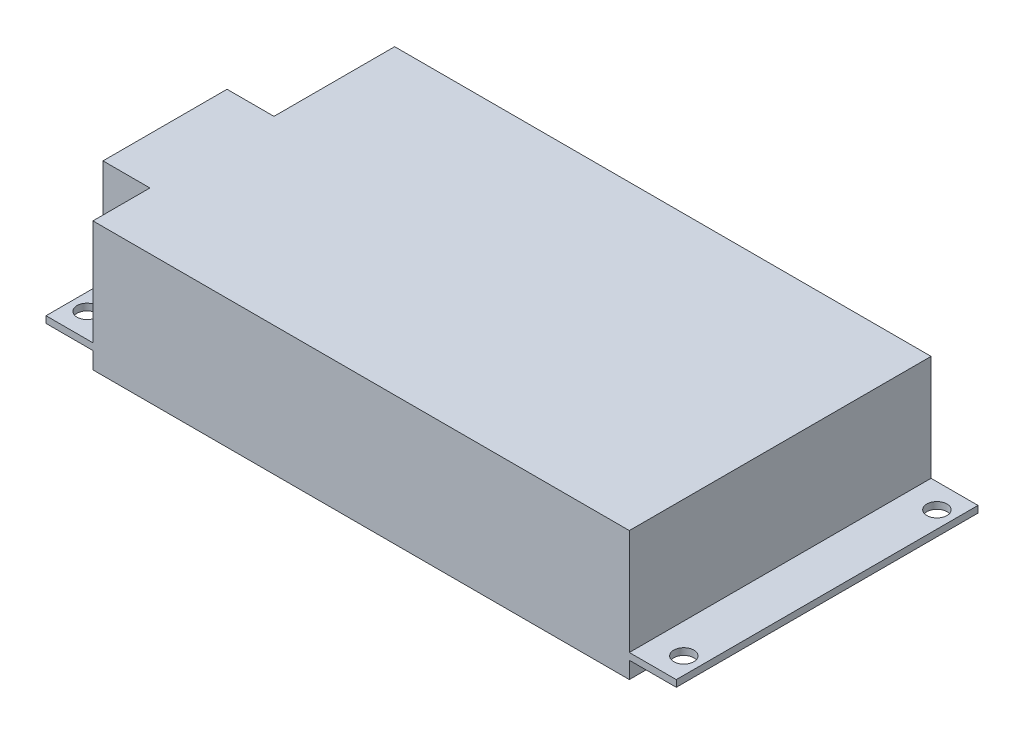
ISO-10303-21;
HEADER;
FILE_DESCRIPTION(('STEP AP214'),'2;1');
FILE_NAME('part.step','',(''),(''),'','','');
FILE_SCHEMA(('AUTOMOTIVE_DESIGN { 1 0 10303 214 1 1 1 1 }'));
ENDSEC;
DATA;
#1=APPLICATION_CONTEXT('core data for automotive mechanical design processes');
#2=APPLICATION_PROTOCOL_DEFINITION('international standard','automotive_design',2000,#1);
#3=PRODUCT_CONTEXT('',#1,'mechanical');
#4=PRODUCT('Part','Part','',(#3));
#5=PRODUCT_RELATED_PRODUCT_CATEGORY('part','',(#4));
#6=PRODUCT_DEFINITION_FORMATION('','',#4);
#7=PRODUCT_DEFINITION_CONTEXT('part definition',#1,'design');
#8=PRODUCT_DEFINITION('design','',#6,#7);
#9=PRODUCT_DEFINITION_SHAPE('','',#8);
#10=(LENGTH_UNIT() NAMED_UNIT(*) SI_UNIT(.MILLI.,.METRE.));
#11=(NAMED_UNIT(*) PLANE_ANGLE_UNIT() SI_UNIT($,.RADIAN.));
#12=(NAMED_UNIT(*) SI_UNIT($,.STERADIAN.) SOLID_ANGLE_UNIT());
#13=UNCERTAINTY_MEASURE_WITH_UNIT(LENGTH_MEASURE(1.E-05),#10,'distance_accuracy_value','');
#14=(GEOMETRIC_REPRESENTATION_CONTEXT(3) GLOBAL_UNCERTAINTY_ASSIGNED_CONTEXT((#13)) GLOBAL_UNIT_ASSIGNED_CONTEXT((#10,
#11,#12)) REPRESENTATION_CONTEXT('',''));
#15=CARTESIAN_POINT('',(0.,0.,0.));
#16=DIRECTION('',(0.,0.,1.));
#17=DIRECTION('',(1.,0.,0.));
#18=AXIS2_PLACEMENT_3D('',#15,#16,#17);
#19=CARTESIAN_POINT('',(0.,2.,0.));
#20=DIRECTION('',(0.,-1.,0.));
#21=DIRECTION('',(0.,0.,-1.));
#22=AXIS2_PLACEMENT_3D('',#19,#20,#21);
#23=PLANE('',#22);
#24=CARTESIAN_POINT('',(-89.,2.,37.75));
#25=DIRECTION('',(0.,1.,0.));
#26=DIRECTION('',(0.,0.,1.));
#27=AXIS2_PLACEMENT_3D('',#24,#25,#26);
#28=CIRCLE('',#27,3.00000000000001);
#29=CARTESIAN_POINT('',(-89.,2.,40.75));
#30=VERTEX_POINT('',#29);
#31=EDGE_CURVE('E323',#30,#30,#28,.T.);
#32=ORIENTED_EDGE('',*,*,#31,.F.);
#33=EDGE_LOOP('',(#32));
#34=FACE_BOUND('',#33,.T.);
#35=DIRECTION('',(0.,0.,1.));
#36=VECTOR('',#35,1.);
#37=CARTESIAN_POINT('',(-80.,2.,0.));
#38=LINE('',#37,#36);
#39=CARTESIAN_POINT('',(-80.,2.,28.));
#40=VERTEX_POINT('',#39);
#41=CARTESIAN_POINT('',(-80.,2.,45.));
#42=VERTEX_POINT('',#41);
#43=EDGE_CURVE('E302',#40,#42,#38,.T.);
#44=ORIENTED_EDGE('',*,*,#43,.F.);
#45=DIRECTION('',(1.,0.,0.));
#46=VECTOR('',#45,1.);
#47=CARTESIAN_POINT('',(0.,2.,28.));
#48=LINE('',#47,#46);
#49=CARTESIAN_POINT('',(-94.,2.,28.));
#50=VERTEX_POINT('',#49);
#51=EDGE_CURVE('E314',#50,#40,#48,.T.);
#52=ORIENTED_EDGE('',*,*,#51,.F.);
#53=DIRECTION('',(0.,0.,1.));
#54=VECTOR('',#53,1.);
#55=CARTESIAN_POINT('',(-94.,2.,45.));
#56=LINE('',#55,#54);
#57=CARTESIAN_POINT('',(-94.,2.,45.));
#58=VERTEX_POINT('',#57);
#59=EDGE_CURVE('E365',#50,#58,#56,.T.);
#60=ORIENTED_EDGE('',*,*,#59,.T.);
#61=DIRECTION('',(1.,0.,0.));
#62=VECTOR('',#61,1.);
#63=CARTESIAN_POINT('',(-94.,2.,45.));
#64=LINE('',#63,#62);
#65=EDGE_CURVE('E370',#58,#42,#64,.T.);
#66=ORIENTED_EDGE('',*,*,#65,.T.);
#67=EDGE_LOOP('',(#44,#52,#60,#66));
#68=FACE_BOUND('',#67,.T.);
#69=ADVANCED_FACE('F41',(#34,#68),#23,.F.);
#70=CARTESIAN_POINT('',(-89.,2.,-37.75));
#71=DIRECTION('',(0.,1.,0.));
#72=DIRECTION('',(0.,0.,1.));
#73=AXIS2_PLACEMENT_3D('',#70,#71,#72);
#74=CIRCLE('',#73,3.00000000000001);
#75=CARTESIAN_POINT('',(-89.,2.,-34.75));
#76=VERTEX_POINT('',#75);
#77=EDGE_CURVE('E347',#76,#76,#74,.T.);
#78=ORIENTED_EDGE('',*,*,#77,.F.);
#79=EDGE_LOOP('',(#78));
#80=FACE_BOUND('',#79,.T.);
#81=CARTESIAN_POINT('',(-94.,2.,-45.));
#82=VERTEX_POINT('',#81);
#83=CARTESIAN_POINT('',(-94.,2.,-9.00000000000001));
#84=VERTEX_POINT('',#83);
#85=EDGE_CURVE('E366',#82,#84,#56,.T.);
#86=ORIENTED_EDGE('',*,*,#85,.T.);
#87=DIRECTION('',(1.,0.,0.));
#88=VECTOR('',#87,1.);
#89=CARTESIAN_POINT('',(0.,2.,-9.00000000000003));
#90=LINE('',#89,#88);
#91=CARTESIAN_POINT('',(-80.,2.,-9.00000000000001));
#92=VERTEX_POINT('',#91);
#93=EDGE_CURVE('E308',#84,#92,#90,.T.);
#94=ORIENTED_EDGE('',*,*,#93,.T.);
#95=DIRECTION('',(0.,0.,1.));
#96=VECTOR('',#95,1.);
#97=CARTESIAN_POINT('',(-80.,2.,0.));
#98=LINE('',#97,#96);
#99=CARTESIAN_POINT('',(-80.,2.,-45.));
#100=VERTEX_POINT('',#99);
#101=EDGE_CURVE('E319',#100,#92,#98,.T.);
#102=ORIENTED_EDGE('',*,*,#101,.F.);
#103=DIRECTION('',(-1.,0.,0.));
#104=VECTOR('',#103,1.);
#105=CARTESIAN_POINT('',(-94.,2.,-45.));
#106=LINE('',#105,#104);
#107=EDGE_CURVE('E359',#100,#82,#106,.T.);
#108=ORIENTED_EDGE('',*,*,#107,.T.);
#109=EDGE_LOOP('',(#86,#94,#102,#108));
#110=FACE_BOUND('',#109,.T.);
#111=ADVANCED_FACE('F463',(#80,#110),#23,.F.);
#112=CARTESIAN_POINT('',(0.,0.,0.));
#113=DIRECTION('',(0.,-1.,0.));
#114=DIRECTION('',(0.,0.,-1.));
#115=AXIS2_PLACEMENT_3D('',#112,#113,#114);
#116=PLANE('',#115);
#117=CARTESIAN_POINT('',(-89.,0.,37.75));
#118=DIRECTION('',(0.,1.,0.));
#119=DIRECTION('',(0.,0.,1.));
#120=AXIS2_PLACEMENT_3D('',#117,#118,#119);
#121=CIRCLE('',#120,3.00000000000001);
#122=CARTESIAN_POINT('',(-89.,0.,40.75));
#123=VERTEX_POINT('',#122);
#124=EDGE_CURVE('E322',#123,#123,#121,.T.);
#125=ORIENTED_EDGE('',*,*,#124,.T.);
#126=EDGE_LOOP('',(#125));
#127=FACE_BOUND('',#126,.T.);
#128=DIRECTION('',(1.,0.,0.));
#129=VECTOR('',#128,1.);
#130=CARTESIAN_POINT('',(0.,0.,28.));
#131=LINE('',#130,#129);
#132=CARTESIAN_POINT('',(-94.,0.,28.));
#133=VERTEX_POINT('',#132);
#134=CARTESIAN_POINT('',(-80.,0.,28.));
#135=VERTEX_POINT('',#134);
#136=EDGE_CURVE('E57',#133,#135,#131,.T.);
#137=ORIENTED_EDGE('',*,*,#136,.T.);
#138=DIRECTION('',(0.,0.,1.));
#139=VECTOR('',#138,1.);
#140=CARTESIAN_POINT('',(-80.,0.,0.));
#141=LINE('',#140,#139);
#142=CARTESIAN_POINT('',(-80.,0.,45.));
#143=VERTEX_POINT('',#142);
#144=EDGE_CURVE('E299',#135,#143,#141,.T.);
#145=ORIENTED_EDGE('',*,*,#144,.T.);
#146=DIRECTION('',(1.,0.,0.));
#147=VECTOR('',#146,1.);
#148=CARTESIAN_POINT('',(-94.,0.,45.));
#149=LINE('',#148,#147);
#150=CARTESIAN_POINT('',(-94.,0.,45.));
#151=VERTEX_POINT('',#150);
#152=EDGE_CURVE('E360',#151,#143,#149,.T.);
#153=ORIENTED_EDGE('',*,*,#152,.F.);
#154=DIRECTION('',(0.,0.,1.));
#155=VECTOR('',#154,1.);
#156=CARTESIAN_POINT('',(-94.,0.,45.));
#157=LINE('',#156,#155);
#158=EDGE_CURVE('E383',#133,#151,#157,.T.);
#159=ORIENTED_EDGE('',*,*,#158,.F.);
#160=EDGE_LOOP('',(#137,#145,#153,#159));
#161=FACE_BOUND('',#160,.T.);
#162=ADVANCED_FACE('F432',(#127,#161),#116,.T.);
#163=DIRECTION('',(1.,0.,0.));
#164=VECTOR('',#163,1.);
#165=CARTESIAN_POINT('',(0.,0.,-9.00000000000003));
#166=LINE('',#165,#164);
#167=CARTESIAN_POINT('',(-94.,0.,-8.99999999999999));
#168=VERTEX_POINT('',#167);
#169=CARTESIAN_POINT('',(-80.,0.,-9.00000000000001));
#170=VERTEX_POINT('',#169);
#171=EDGE_CURVE('E305',#168,#170,#166,.T.);
#172=ORIENTED_EDGE('',*,*,#171,.F.);
#173=CARTESIAN_POINT('',(-94.,0.,-45.));
#174=VERTEX_POINT('',#173);
#175=EDGE_CURVE('E384',#174,#168,#157,.T.);
#176=ORIENTED_EDGE('',*,*,#175,.F.);
#177=DIRECTION('',(-1.,0.,0.));
#178=VECTOR('',#177,1.);
#179=CARTESIAN_POINT('',(-94.,0.,-45.));
#180=LINE('',#179,#178);
#181=CARTESIAN_POINT('',(-80.,0.,-45.));
#182=VERTEX_POINT('',#181);
#183=EDGE_CURVE('E378',#182,#174,#180,.T.);
#184=ORIENTED_EDGE('',*,*,#183,.F.);
#185=DIRECTION('',(0.,0.,1.));
#186=VECTOR('',#185,1.);
#187=CARTESIAN_POINT('',(-80.,0.,0.));
#188=LINE('',#187,#186);
#189=EDGE_CURVE('E65',#182,#170,#188,.T.);
#190=ORIENTED_EDGE('',*,*,#189,.T.);
#191=EDGE_LOOP('',(#172,#176,#184,#190));
#192=FACE_BOUND('',#191,.T.);
#193=CARTESIAN_POINT('',(-89.,0.,-37.75));
#194=DIRECTION('',(0.,1.,0.));
#195=DIRECTION('',(0.,0.,1.));
#196=AXIS2_PLACEMENT_3D('',#193,#194,#195);
#197=CIRCLE('',#196,3.00000000000001);
#198=CARTESIAN_POINT('',(-89.,0.,-34.75));
#199=VERTEX_POINT('',#198);
#200=EDGE_CURVE('E343',#199,#199,#197,.T.);
#201=ORIENTED_EDGE('',*,*,#200,.T.);
#202=EDGE_LOOP('',(#201));
#203=FACE_BOUND('',#202,.T.);
#204=ADVANCED_FACE('F408',(#192,#203),#116,.T.);
#205=CARTESIAN_POINT('',(94.,2.,-45.));
#206=VERTEX_POINT('',#205);
#207=CARTESIAN_POINT('',(80.,2.,-45.));
#208=VERTEX_POINT('',#207);
#209=EDGE_CURVE('E361',#206,#208,#106,.T.);
#210=ORIENTED_EDGE('',*,*,#209,.T.);
#211=DIRECTION('',(0.,0.,1.));
#212=VECTOR('',#211,1.);
#213=CARTESIAN_POINT('',(80.,2.,0.));
#214=LINE('',#213,#212);
#215=CARTESIAN_POINT('',(80.,2.,45.));
#216=VERTEX_POINT('',#215);
#217=EDGE_CURVE('E296',#208,#216,#214,.T.);
#218=ORIENTED_EDGE('',*,*,#217,.T.);
#219=CARTESIAN_POINT('',(94.,2.,45.));
#220=VERTEX_POINT('',#219);
#221=EDGE_CURVE('E187',#216,#220,#64,.T.);
#222=ORIENTED_EDGE('',*,*,#221,.T.);
#223=DIRECTION('',(0.,0.,-1.));
#224=VECTOR('',#223,1.);
#225=CARTESIAN_POINT('',(94.,2.,45.));
#226=LINE('',#225,#224);
#227=EDGE_CURVE('E355',#220,#206,#226,.T.);
#228=ORIENTED_EDGE('',*,*,#227,.T.);
#229=EDGE_LOOP('',(#210,#218,#222,#228));
#230=FACE_BOUND('',#229,.T.);
#231=CARTESIAN_POINT('',(89.,2.,-37.75));
#232=DIRECTION('',(0.,1.,0.));
#233=DIRECTION('',(0.,0.,1.));
#234=AXIS2_PLACEMENT_3D('',#231,#232,#233);
#235=CIRCLE('',#234,3.00000000000001);
#236=CARTESIAN_POINT('',(89.,2.,-34.75));
#237=VERTEX_POINT('',#236);
#238=EDGE_CURVE('E339',#237,#237,#235,.T.);
#239=ORIENTED_EDGE('',*,*,#238,.F.);
#240=EDGE_LOOP('',(#239));
#241=FACE_BOUND('',#240,.T.);
#242=CARTESIAN_POINT('',(89.,2.,37.75));
#243=DIRECTION('',(0.,1.,0.));
#244=DIRECTION('',(0.,0.,1.));
#245=AXIS2_PLACEMENT_3D('',#242,#243,#244);
#246=CIRCLE('',#245,3.00000000000001);
#247=CARTESIAN_POINT('',(89.,2.,40.75));
#248=VERTEX_POINT('',#247);
#249=EDGE_CURVE('E331',#248,#248,#246,.T.);
#250=ORIENTED_EDGE('',*,*,#249,.F.);
#251=EDGE_LOOP('',(#250));
#252=FACE_BOUND('',#251,.T.);
#253=ADVANCED_FACE('F483',(#230,#241,#252),#23,.F.);
#254=DIRECTION('',(0.,0.,1.));
#255=VECTOR('',#254,1.);
#256=CARTESIAN_POINT('',(80.,0.,0.));
#257=LINE('',#256,#255);
#258=CARTESIAN_POINT('',(80.,0.,-45.));
#259=VERTEX_POINT('',#258);
#260=CARTESIAN_POINT('',(80.,0.,45.));
#261=VERTEX_POINT('',#260);
#262=EDGE_CURVE('E260',#259,#261,#257,.T.);
#263=ORIENTED_EDGE('',*,*,#262,.F.);
#264=CARTESIAN_POINT('',(94.,0.,-45.));
#265=VERTEX_POINT('',#264);
#266=EDGE_CURVE('E379',#265,#259,#180,.T.);
#267=ORIENTED_EDGE('',*,*,#266,.F.);
#268=DIRECTION('',(0.,0.,-1.));
#269=VECTOR('',#268,1.);
#270=CARTESIAN_POINT('',(94.,0.,45.));
#271=LINE('',#270,#269);
#272=CARTESIAN_POINT('',(94.,0.,45.));
#273=VERTEX_POINT('',#272);
#274=EDGE_CURVE('E351',#273,#265,#271,.T.);
#275=ORIENTED_EDGE('',*,*,#274,.F.);
#276=EDGE_CURVE('E388',#261,#273,#149,.T.);
#277=ORIENTED_EDGE('',*,*,#276,.F.);
#278=EDGE_LOOP('',(#263,#267,#275,#277));
#279=FACE_BOUND('',#278,.T.);
#280=CARTESIAN_POINT('',(89.,0.,37.75));
#281=DIRECTION('',(0.,1.,0.));
#282=DIRECTION('',(0.,0.,1.));
#283=AXIS2_PLACEMENT_3D('',#280,#281,#282);
#284=CIRCLE('',#283,3.00000000000001);
#285=CARTESIAN_POINT('',(89.,0.,40.75));
#286=VERTEX_POINT('',#285);
#287=EDGE_CURVE('E327',#286,#286,#284,.T.);
#288=ORIENTED_EDGE('',*,*,#287,.T.);
#289=EDGE_LOOP('',(#288));
#290=FACE_BOUND('',#289,.T.);
#291=CARTESIAN_POINT('',(89.,0.,-37.75));
#292=DIRECTION('',(0.,1.,0.));
#293=DIRECTION('',(0.,0.,1.));
#294=AXIS2_PLACEMENT_3D('',#291,#292,#293);
#295=CIRCLE('',#294,3.00000000000001);
#296=CARTESIAN_POINT('',(89.,0.,-34.75));
#297=VERTEX_POINT('',#296);
#298=EDGE_CURVE('E335',#297,#297,#295,.T.);
#299=ORIENTED_EDGE('',*,*,#298,.T.);
#300=EDGE_LOOP('',(#299));
#301=FACE_BOUND('',#300,.T.);
#302=ADVANCED_FACE('F492',(#279,#290,#301),#116,.T.);
#303=CARTESIAN_POINT('',(94.,2.,45.));
#304=DIRECTION('',(-1.,0.,0.));
#305=DIRECTION('',(0.,0.,1.));
#306=AXIS2_PLACEMENT_3D('',#303,#304,#305);
#307=PLANE('',#306);
#308=ORIENTED_EDGE('',*,*,#274,.T.);
#309=DIRECTION('',(0.,-1.,0.));
#310=VECTOR('',#309,1.);
#311=CARTESIAN_POINT('',(94.,2.,-45.));
#312=LINE('',#311,#310);
#313=EDGE_CURVE('E11',#206,#265,#312,.T.);
#314=ORIENTED_EDGE('',*,*,#313,.F.);
#315=ORIENTED_EDGE('',*,*,#227,.F.);
#316=DIRECTION('',(0.,-1.,0.));
#317=VECTOR('',#316,1.);
#318=CARTESIAN_POINT('',(94.,2.,45.));
#319=LINE('',#318,#317);
#320=EDGE_CURVE('E374',#220,#273,#319,.T.);
#321=ORIENTED_EDGE('',*,*,#320,.T.);
#322=EDGE_LOOP('',(#308,#314,#315,#321));
#323=FACE_BOUND('',#322,.T.);
#324=ADVANCED_FACE('F43',(#323),#307,.F.);
#325=CARTESIAN_POINT('',(-94.,2.,-45.));
#326=DIRECTION('',(0.,0.,1.));
#327=DIRECTION('',(1.,0.,0.));
#328=AXIS2_PLACEMENT_3D('',#325,#326,#327);
#329=PLANE('',#328);
#330=ORIENTED_EDGE('',*,*,#266,.T.);
#331=DIRECTION('',(0.,1.,0.));
#332=VECTOR('',#331,1.);
#333=CARTESIAN_POINT('',(80.,-5.,-45.));
#334=LINE('',#333,#332);
#335=CARTESIAN_POINT('',(80.,-5.,-45.));
#336=VERTEX_POINT('',#335);
#337=EDGE_CURVE('E287',#336,#259,#334,.T.);
#338=ORIENTED_EDGE('',*,*,#337,.F.);
#339=DIRECTION('',(-1.,0.,0.));
#340=VECTOR('',#339,1.);
#341=CARTESIAN_POINT('',(0.,-5.,-45.));
#342=LINE('',#341,#340);
#343=CARTESIAN_POINT('',(-80.,-5.,-45.));
#344=VERTEX_POINT('',#343);
#345=EDGE_CURVE('E238',#336,#344,#342,.T.);
#346=ORIENTED_EDGE('',*,*,#345,.T.);
#347=DIRECTION('',(0.,1.,0.));
#348=VECTOR('',#347,1.);
#349=CARTESIAN_POINT('',(-80.,-5.,-45.));
#350=LINE('',#349,#348);
#351=EDGE_CURVE('E282',#344,#182,#350,.T.);
#352=ORIENTED_EDGE('',*,*,#351,.T.);
#353=ORIENTED_EDGE('',*,*,#183,.T.);
#354=DIRECTION('',(0.,-1.,0.));
#355=VECTOR('',#354,1.);
#356=CARTESIAN_POINT('',(-94.,2.,-45.));
#357=LINE('',#356,#355);
#358=EDGE_CURVE('E50',#82,#174,#357,.T.);
#359=ORIENTED_EDGE('',*,*,#358,.F.);
#360=ORIENTED_EDGE('',*,*,#107,.F.);
#361=CARTESIAN_POINT('',(-80.,33.5,-45.));
#362=VERTEX_POINT('',#361);
#363=EDGE_CURVE('E286',#100,#362,#350,.T.);
#364=ORIENTED_EDGE('',*,*,#363,.T.);
#365=DIRECTION('',(-1.,0.,0.));
#366=VECTOR('',#365,1.);
#367=CARTESIAN_POINT('',(0.,33.5,-45.));
#368=LINE('',#367,#366);
#369=CARTESIAN_POINT('',(80.,33.5,-45.));
#370=VERTEX_POINT('',#369);
#371=EDGE_CURVE('E203',#370,#362,#368,.T.);
#372=ORIENTED_EDGE('',*,*,#371,.F.);
#373=EDGE_CURVE('E198',#208,#370,#334,.T.);
#374=ORIENTED_EDGE('',*,*,#373,.F.);
#375=ORIENTED_EDGE('',*,*,#209,.F.);
#376=ORIENTED_EDGE('',*,*,#313,.T.);
#377=EDGE_LOOP('',(#330,#338,#346,#352,#353,#359,#360,#364,#372,#374,#375,#376));
#378=FACE_BOUND('',#377,.T.);
#379=ADVANCED_FACE('F465',(#378),#329,.F.);
#380=CARTESIAN_POINT('',(-94.,2.,45.));
#381=DIRECTION('',(1.,0.,0.));
#382=DIRECTION('',(0.,0.,-1.));
#383=AXIS2_PLACEMENT_3D('',#380,#381,#382);
#384=PLANE('',#383);
#385=ORIENTED_EDGE('',*,*,#175,.T.);
#386=DIRECTION('',(0.,1.,0.));
#387=VECTOR('',#386,1.);
#388=CARTESIAN_POINT('',(-94.,-5.,-9.00000000000001));
#389=LINE('',#388,#387);
#390=CARTESIAN_POINT('',(-94.,-5.,-9.00000000000001));
#391=VERTEX_POINT('',#390);
#392=EDGE_CURVE('E272',#391,#168,#389,.T.);
#393=ORIENTED_EDGE('',*,*,#392,.F.);
#394=DIRECTION('',(0.,0.,1.));
#395=VECTOR('',#394,1.);
#396=CARTESIAN_POINT('',(-94.,-5.,0.));
#397=LINE('',#396,#395);
#398=CARTESIAN_POINT('',(-94.,-5.,28.));
#399=VERTEX_POINT('',#398);
#400=EDGE_CURVE('E249',#391,#399,#397,.T.);
#401=ORIENTED_EDGE('',*,*,#400,.T.);
#402=DIRECTION('',(0.,1.,0.));
#403=VECTOR('',#402,1.);
#404=CARTESIAN_POINT('',(-94.,-5.,28.));
#405=LINE('',#404,#403);
#406=EDGE_CURVE('E267',#399,#133,#405,.T.);
#407=ORIENTED_EDGE('',*,*,#406,.T.);
#408=ORIENTED_EDGE('',*,*,#158,.T.);
#409=DIRECTION('',(0.,-1.,0.));
#410=VECTOR('',#409,1.);
#411=CARTESIAN_POINT('',(-94.,2.,45.));
#412=LINE('',#411,#410);
#413=EDGE_CURVE('E395',#58,#151,#412,.T.);
#414=ORIENTED_EDGE('',*,*,#413,.F.);
#415=ORIENTED_EDGE('',*,*,#59,.F.);
#416=CARTESIAN_POINT('',(-94.,33.5,28.));
#417=VERTEX_POINT('',#416);
#418=EDGE_CURVE('E271',#50,#417,#405,.T.);
#419=ORIENTED_EDGE('',*,*,#418,.T.);
#420=DIRECTION('',(0.,0.,1.));
#421=VECTOR('',#420,1.);
#422=CARTESIAN_POINT('',(-94.,33.5,0.));
#423=LINE('',#422,#421);
#424=CARTESIAN_POINT('',(-94.,33.5,-9.00000000000001));
#425=VERTEX_POINT('',#424);
#426=EDGE_CURVE('E222',#425,#417,#423,.T.);
#427=ORIENTED_EDGE('',*,*,#426,.F.);
#428=EDGE_CURVE('E276',#84,#425,#389,.T.);
#429=ORIENTED_EDGE('',*,*,#428,.F.);
#430=ORIENTED_EDGE('',*,*,#85,.F.);
#431=ORIENTED_EDGE('',*,*,#358,.T.);
#432=EDGE_LOOP('',(#385,#393,#401,#407,#408,#414,#415,#419,#427,#429,#430,#431));
#433=FACE_BOUND('',#432,.T.);
#434=ADVANCED_FACE('F404',(#433),#384,.F.);
#435=CARTESIAN_POINT('',(-94.,2.,45.));
#436=DIRECTION('',(0.,0.,-1.));
#437=DIRECTION('',(-1.,0.,0.));
#438=AXIS2_PLACEMENT_3D('',#435,#436,#437);
#439=PLANE('',#438);
#440=ORIENTED_EDGE('',*,*,#221,.F.);
#441=DIRECTION('',(0.,1.,0.));
#442=VECTOR('',#441,1.);
#443=CARTESIAN_POINT('',(80.,-5.,45.));
#444=LINE('',#443,#442);
#445=CARTESIAN_POINT('',(80.,33.5,45.));
#446=VERTEX_POINT('',#445);
#447=EDGE_CURVE('E179',#216,#446,#444,.T.);
#448=ORIENTED_EDGE('',*,*,#447,.T.);
#449=DIRECTION('',(1.,0.,0.));
#450=VECTOR('',#449,1.);
#451=CARTESIAN_POINT('',(0.,33.5,45.));
#452=LINE('',#451,#450);
#453=CARTESIAN_POINT('',(-80.,33.5,45.));
#454=VERTEX_POINT('',#453);
#455=EDGE_CURVE('E184',#454,#446,#452,.T.);
#456=ORIENTED_EDGE('',*,*,#455,.F.);
#457=DIRECTION('',(0.,1.,0.));
#458=VECTOR('',#457,1.);
#459=CARTESIAN_POINT('',(-80.,-5.,45.));
#460=LINE('',#459,#458);
#461=EDGE_CURVE('E261',#42,#454,#460,.T.);
#462=ORIENTED_EDGE('',*,*,#461,.F.);
#463=ORIENTED_EDGE('',*,*,#65,.F.);
#464=ORIENTED_EDGE('',*,*,#413,.T.);
#465=ORIENTED_EDGE('',*,*,#152,.T.);
#466=CARTESIAN_POINT('',(-80.,-5.,45.));
#467=VERTEX_POINT('',#466);
#468=EDGE_CURVE('E256',#467,#143,#460,.T.);
#469=ORIENTED_EDGE('',*,*,#468,.F.);
#470=DIRECTION('',(1.,0.,0.));
#471=VECTOR('',#470,1.);
#472=CARTESIAN_POINT('',(0.,-5.,45.));
#473=LINE('',#472,#471);
#474=CARTESIAN_POINT('',(80.,-5.,45.));
#475=VERTEX_POINT('',#474);
#476=EDGE_CURVE('E230',#467,#475,#473,.T.);
#477=ORIENTED_EDGE('',*,*,#476,.T.);
#478=EDGE_CURVE('E191',#475,#261,#444,.T.);
#479=ORIENTED_EDGE('',*,*,#478,.T.);
#480=ORIENTED_EDGE('',*,*,#276,.T.);
#481=ORIENTED_EDGE('',*,*,#320,.F.);
#482=EDGE_LOOP('',(#440,#448,#456,#462,#463,#464,#465,#469,#477,#479,#480,#481));
#483=FACE_BOUND('',#482,.T.);
#484=ADVANCED_FACE('F181',(#483),#439,.F.);
#485=CARTESIAN_POINT('',(-89.,2.,-37.75));
#486=DIRECTION('',(0.,-1.,0.));
#487=DIRECTION('',(0.,0.,-1.));
#488=AXIS2_PLACEMENT_3D('',#485,#486,#487);
#489=CYLINDRICAL_SURFACE('',#488,3.00000000000001);
#490=ORIENTED_EDGE('',*,*,#77,.T.);
#491=EDGE_LOOP('',(#490));
#492=FACE_BOUND('',#491,.T.);
#493=ORIENTED_EDGE('',*,*,#200,.F.);
#494=EDGE_LOOP('',(#493));
#495=FACE_BOUND('',#494,.T.);
#496=ADVANCED_FACE('F516',(#492,#495),#489,.F.);
#497=CARTESIAN_POINT('',(89.,2.,-37.75));
#498=DIRECTION('',(0.,-1.,0.));
#499=DIRECTION('',(0.,0.,-1.));
#500=AXIS2_PLACEMENT_3D('',#497,#498,#499);
#501=CYLINDRICAL_SURFACE('',#500,3.00000000000001);
#502=ORIENTED_EDGE('',*,*,#238,.T.);
#503=EDGE_LOOP('',(#502));
#504=FACE_BOUND('',#503,.T.);
#505=ORIENTED_EDGE('',*,*,#298,.F.);
#506=EDGE_LOOP('',(#505));
#507=FACE_BOUND('',#506,.T.);
#508=ADVANCED_FACE('F508',(#504,#507),#501,.F.);
#509=CARTESIAN_POINT('',(89.,2.,37.75));
#510=DIRECTION('',(0.,-1.,0.));
#511=DIRECTION('',(0.,0.,-1.));
#512=AXIS2_PLACEMENT_3D('',#509,#510,#511);
#513=CYLINDRICAL_SURFACE('',#512,3.00000000000001);
#514=ORIENTED_EDGE('',*,*,#249,.T.);
#515=EDGE_LOOP('',(#514));
#516=FACE_BOUND('',#515,.T.);
#517=ORIENTED_EDGE('',*,*,#287,.F.);
#518=EDGE_LOOP('',(#517));
#519=FACE_BOUND('',#518,.T.);
#520=ADVANCED_FACE('F504',(#516,#519),#513,.F.);
#521=CARTESIAN_POINT('',(-89.,2.,37.75));
#522=DIRECTION('',(0.,-1.,0.));
#523=DIRECTION('',(0.,0.,-1.));
#524=AXIS2_PLACEMENT_3D('',#521,#522,#523);
#525=CYLINDRICAL_SURFACE('',#524,3.00000000000001);
#526=ORIENTED_EDGE('',*,*,#31,.T.);
#527=EDGE_LOOP('',(#526));
#528=FACE_BOUND('',#527,.T.);
#529=ORIENTED_EDGE('',*,*,#124,.F.);
#530=EDGE_LOOP('',(#529));
#531=FACE_BOUND('',#530,.T.);
#532=ADVANCED_FACE('F507',(#528,#531),#525,.F.);
#533=CARTESIAN_POINT('',(0.,-5.,0.));
#534=DIRECTION('',(0.,1.,0.));
#535=DIRECTION('',(0.,0.,1.));
#536=AXIS2_PLACEMENT_3D('',#533,#534,#535);
#537=PLANE('',#536);
#538=ORIENTED_EDGE('',*,*,#476,.F.);
#539=DIRECTION('',(0.,0.,-1.));
#540=VECTOR('',#539,1.);
#541=CARTESIAN_POINT('',(-80.,-5.,0.));
#542=LINE('',#541,#540);
#543=CARTESIAN_POINT('',(-80.,-5.,28.));
#544=VERTEX_POINT('',#543);
#545=EDGE_CURVE('E192',#467,#544,#542,.T.);
#546=ORIENTED_EDGE('',*,*,#545,.T.);
#547=DIRECTION('',(-1.,0.,0.));
#548=VECTOR('',#547,1.);
#549=CARTESIAN_POINT('',(0.,-5.,28.));
#550=LINE('',#549,#548);
#551=EDGE_CURVE('E253',#544,#399,#550,.T.);
#552=ORIENTED_EDGE('',*,*,#551,.T.);
#553=ORIENTED_EDGE('',*,*,#400,.F.);
#554=DIRECTION('',(-1.,0.,0.));
#555=VECTOR('',#554,1.);
#556=CARTESIAN_POINT('',(0.,-5.,-9.00000000000003));
#557=LINE('',#556,#555);
#558=CARTESIAN_POINT('',(-80.,-5.,-9.00000000000001));
#559=VERTEX_POINT('',#558);
#560=EDGE_CURVE('E245',#559,#391,#557,.T.);
#561=ORIENTED_EDGE('',*,*,#560,.F.);
#562=EDGE_CURVE('E242',#559,#344,#542,.T.);
#563=ORIENTED_EDGE('',*,*,#562,.T.);
#564=ORIENTED_EDGE('',*,*,#345,.F.);
#565=DIRECTION('',(0.,0.,-1.));
#566=VECTOR('',#565,1.);
#567=CARTESIAN_POINT('',(80.,-5.,0.));
#568=LINE('',#567,#566);
#569=EDGE_CURVE('E234',#475,#336,#568,.T.);
#570=ORIENTED_EDGE('',*,*,#569,.F.);
#571=EDGE_LOOP('',(#538,#546,#552,#553,#561,#563,#564,#570));
#572=FACE_BOUND('',#571,.T.);
#573=ADVANCED_FACE('F421',(#572),#537,.F.);
#574=CARTESIAN_POINT('',(80.,-5.,0.));
#575=DIRECTION('',(1.,0.,0.));
#576=DIRECTION('',(0.,0.,-1.));
#577=AXIS2_PLACEMENT_3D('',#574,#575,#576);
#578=PLANE('',#577);
#579=ORIENTED_EDGE('',*,*,#337,.T.);
#580=ORIENTED_EDGE('',*,*,#262,.T.);
#581=ORIENTED_EDGE('',*,*,#478,.F.);
#582=ORIENTED_EDGE('',*,*,#569,.T.);
#583=EDGE_LOOP('',(#579,#580,#581,#582));
#584=FACE_BOUND('',#583,.T.);
#585=ADVANCED_FACE('F526',(#584),#578,.T.);
#586=CARTESIAN_POINT('',(-80.,-5.,0.));
#587=DIRECTION('',(1.,0.,0.));
#588=DIRECTION('',(0.,0.,-1.));
#589=AXIS2_PLACEMENT_3D('',#586,#587,#588);
#590=PLANE('',#589);
#591=ORIENTED_EDGE('',*,*,#189,.F.);
#592=ORIENTED_EDGE('',*,*,#351,.F.);
#593=ORIENTED_EDGE('',*,*,#562,.F.);
#594=DIRECTION('',(0.,1.,0.));
#595=VECTOR('',#594,1.);
#596=CARTESIAN_POINT('',(-80.,-5.,-9.00000000000001));
#597=LINE('',#596,#595);
#598=EDGE_CURVE('E277',#559,#170,#597,.T.);
#599=ORIENTED_EDGE('',*,*,#598,.T.);
#600=EDGE_LOOP('',(#591,#592,#593,#599));
#601=FACE_BOUND('',#600,.T.);
#602=ADVANCED_FACE('F414',(#601),#590,.F.);
#603=CARTESIAN_POINT('',(0.,-5.,-9.00000000000003));
#604=DIRECTION('',(0.,0.,-1.));
#605=DIRECTION('',(-1.,0.,0.));
#606=AXIS2_PLACEMENT_3D('',#603,#604,#605);
#607=PLANE('',#606);
#608=ORIENTED_EDGE('',*,*,#392,.T.);
#609=ORIENTED_EDGE('',*,*,#171,.T.);
#610=ORIENTED_EDGE('',*,*,#598,.F.);
#611=ORIENTED_EDGE('',*,*,#560,.T.);
#612=EDGE_LOOP('',(#608,#609,#610,#611));
#613=FACE_BOUND('',#612,.T.);
#614=ADVANCED_FACE('F411',(#613),#607,.T.);
#615=CARTESIAN_POINT('',(0.,-5.,28.));
#616=DIRECTION('',(0.,0.,-1.));
#617=DIRECTION('',(-1.,0.,0.));
#618=AXIS2_PLACEMENT_3D('',#615,#616,#617);
#619=PLANE('',#618);
#620=ORIENTED_EDGE('',*,*,#136,.F.);
#621=ORIENTED_EDGE('',*,*,#406,.F.);
#622=ORIENTED_EDGE('',*,*,#551,.F.);
#623=DIRECTION('',(0.,1.,0.));
#624=VECTOR('',#623,1.);
#625=CARTESIAN_POINT('',(-80.,-5.,28.));
#626=LINE('',#625,#624);
#627=EDGE_CURVE('E262',#544,#135,#626,.T.);
#628=ORIENTED_EDGE('',*,*,#627,.T.);
#629=EDGE_LOOP('',(#620,#621,#622,#628));
#630=FACE_BOUND('',#629,.T.);
#631=ADVANCED_FACE('F426',(#630),#619,.F.);
#632=ORIENTED_EDGE('',*,*,#144,.F.);
#633=ORIENTED_EDGE('',*,*,#627,.F.);
#634=ORIENTED_EDGE('',*,*,#545,.F.);
#635=ORIENTED_EDGE('',*,*,#468,.T.);
#636=EDGE_LOOP('',(#632,#633,#634,#635));
#637=FACE_BOUND('',#636,.T.);
#638=ADVANCED_FACE('F430',(#637),#590,.F.);
#639=ORIENTED_EDGE('',*,*,#363,.F.);
#640=ORIENTED_EDGE('',*,*,#101,.T.);
#641=CARTESIAN_POINT('',(-80.,33.5,-9.00000000000001));
#642=VERTEX_POINT('',#641);
#643=EDGE_CURVE('E281',#92,#642,#597,.T.);
#644=ORIENTED_EDGE('',*,*,#643,.T.);
#645=DIRECTION('',(0.,0.,-1.));
#646=VECTOR('',#645,1.);
#647=CARTESIAN_POINT('',(-80.,33.5,0.));
#648=LINE('',#647,#646);
#649=EDGE_CURVE('E214',#642,#362,#648,.T.);
#650=ORIENTED_EDGE('',*,*,#649,.T.);
#651=EDGE_LOOP('',(#639,#640,#644,#650));
#652=FACE_BOUND('',#651,.T.);
#653=ADVANCED_FACE('F467',(#652),#590,.F.);
#654=ORIENTED_EDGE('',*,*,#418,.F.);
#655=ORIENTED_EDGE('',*,*,#51,.T.);
#656=CARTESIAN_POINT('',(-80.,33.5,28.));
#657=VERTEX_POINT('',#656);
#658=EDGE_CURVE('E266',#40,#657,#626,.T.);
#659=ORIENTED_EDGE('',*,*,#658,.T.);
#660=DIRECTION('',(-1.,0.,0.));
#661=VECTOR('',#660,1.);
#662=CARTESIAN_POINT('',(0.,33.5,28.));
#663=LINE('',#662,#661);
#664=EDGE_CURVE('E226',#657,#417,#663,.T.);
#665=ORIENTED_EDGE('',*,*,#664,.T.);
#666=EDGE_LOOP('',(#654,#655,#659,#665));
#667=FACE_BOUND('',#666,.T.);
#668=ADVANCED_FACE('F458',(#667),#619,.F.);
#669=ORIENTED_EDGE('',*,*,#93,.F.);
#670=ORIENTED_EDGE('',*,*,#428,.T.);
#671=DIRECTION('',(-1.,0.,0.));
#672=VECTOR('',#671,1.);
#673=CARTESIAN_POINT('',(0.,33.5,-9.00000000000003));
#674=LINE('',#673,#672);
#675=EDGE_CURVE('E218',#642,#425,#674,.T.);
#676=ORIENTED_EDGE('',*,*,#675,.F.);
#677=ORIENTED_EDGE('',*,*,#643,.F.);
#678=EDGE_LOOP('',(#669,#670,#676,#677));
#679=FACE_BOUND('',#678,.T.);
#680=ADVANCED_FACE('F469',(#679),#607,.T.);
#681=ORIENTED_EDGE('',*,*,#658,.F.);
#682=ORIENTED_EDGE('',*,*,#43,.T.);
#683=ORIENTED_EDGE('',*,*,#461,.T.);
#684=EDGE_CURVE('E208',#454,#657,#648,.T.);
#685=ORIENTED_EDGE('',*,*,#684,.T.);
#686=EDGE_LOOP('',(#681,#682,#683,#685));
#687=FACE_BOUND('',#686,.T.);
#688=ADVANCED_FACE('F455',(#687),#590,.F.);
#689=ORIENTED_EDGE('',*,*,#217,.F.);
#690=ORIENTED_EDGE('',*,*,#373,.T.);
#691=DIRECTION('',(0.,0.,-1.));
#692=VECTOR('',#691,1.);
#693=CARTESIAN_POINT('',(80.,33.5,0.));
#694=LINE('',#693,#692);
#695=EDGE_CURVE('E195',#446,#370,#694,.T.);
#696=ORIENTED_EDGE('',*,*,#695,.F.);
#697=ORIENTED_EDGE('',*,*,#447,.F.);
#698=EDGE_LOOP('',(#689,#690,#696,#697));
#699=FACE_BOUND('',#698,.T.);
#700=ADVANCED_FACE('F196',(#699),#578,.T.);
#701=CARTESIAN_POINT('',(0.,33.5,0.));
#702=DIRECTION('',(0.,1.,0.));
#703=DIRECTION('',(0.,0.,1.));
#704=AXIS2_PLACEMENT_3D('',#701,#702,#703);
#705=PLANE('',#704);
#706=ORIENTED_EDGE('',*,*,#455,.T.);
#707=ORIENTED_EDGE('',*,*,#695,.T.);
#708=ORIENTED_EDGE('',*,*,#371,.T.);
#709=ORIENTED_EDGE('',*,*,#649,.F.);
#710=ORIENTED_EDGE('',*,*,#675,.T.);
#711=ORIENTED_EDGE('',*,*,#426,.T.);
#712=ORIENTED_EDGE('',*,*,#664,.F.);
#713=ORIENTED_EDGE('',*,*,#684,.F.);
#714=EDGE_LOOP('',(#706,#707,#708,#709,#710,#711,#712,#713));
#715=FACE_BOUND('',#714,.T.);
#716=ADVANCED_FACE('F205',(#715),#705,.T.);
#717=CLOSED_SHELL('',(#69,#111,#162,#204,#253,#302,#324,#379,#434,#484,#496,#508,#520,#532,#573,
#585,#602,#614,#631,#638,#653,#668,#680,#688,#700,#716));
#718=MANIFOLD_SOLID_BREP('B2',#717);
#719=ADVANCED_BREP_SHAPE_REPRESENTATION('',(#18,#718),#14);
#720=SHAPE_DEFINITION_REPRESENTATION(#9,#719);
ENDSEC;
END-ISO-10303-21;
